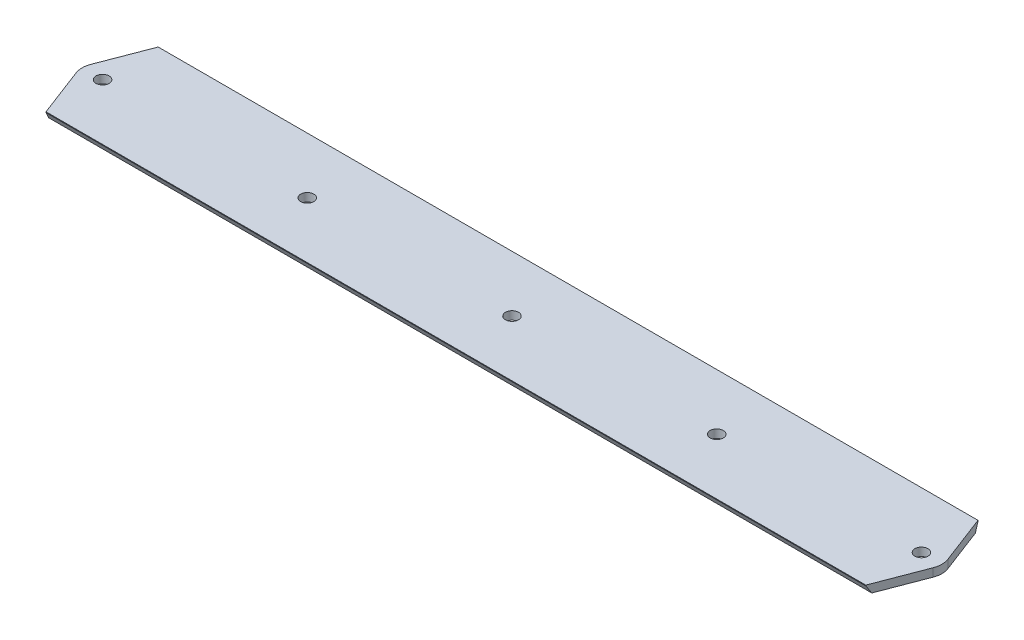
ISO-10303-21;
HEADER;
FILE_DESCRIPTION(('STEP AP214'),'2;1');
FILE_NAME('part.step','',(''),(''),'','','');
FILE_SCHEMA(('AUTOMOTIVE_DESIGN { 1 0 10303 214 1 1 1 1 }'));
ENDSEC;
DATA;
#1=APPLICATION_CONTEXT('core data for automotive mechanical design processes');
#2=APPLICATION_PROTOCOL_DEFINITION('international standard','automotive_design',2000,#1);
#3=PRODUCT_CONTEXT('',#1,'mechanical');
#4=PRODUCT('Part','Part','',(#3));
#5=PRODUCT_RELATED_PRODUCT_CATEGORY('part','',(#4));
#6=PRODUCT_DEFINITION_FORMATION('','',#4);
#7=PRODUCT_DEFINITION_CONTEXT('part definition',#1,'design');
#8=PRODUCT_DEFINITION('design','',#6,#7);
#9=PRODUCT_DEFINITION_SHAPE('','',#8);
#10=(LENGTH_UNIT() NAMED_UNIT(*) SI_UNIT(.MILLI.,.METRE.));
#11=(NAMED_UNIT(*) PLANE_ANGLE_UNIT() SI_UNIT($,.RADIAN.));
#12=(NAMED_UNIT(*) SI_UNIT($,.STERADIAN.) SOLID_ANGLE_UNIT());
#13=UNCERTAINTY_MEASURE_WITH_UNIT(LENGTH_MEASURE(1.E-05),#10,'distance_accuracy_value','');
#14=(GEOMETRIC_REPRESENTATION_CONTEXT(3) GLOBAL_UNCERTAINTY_ASSIGNED_CONTEXT((#13)) GLOBAL_UNIT_ASSIGNED_CONTEXT((#10,
#11,#12)) REPRESENTATION_CONTEXT('',''));
#15=CARTESIAN_POINT('',(0.,0.,0.));
#16=DIRECTION('',(0.,0.,1.));
#17=DIRECTION('',(1.,0.,0.));
#18=AXIS2_PLACEMENT_3D('',#15,#16,#17);
#19=CARTESIAN_POINT('',(-113.726371317059,2.,43.4843648935652));
#20=DIRECTION('',(0.934049773615858,0.,-0.357142857142858));
#21=DIRECTION('',(-0.357142857142858,0.,-0.934049773615859));
#22=AXIS2_PLACEMENT_3D('',#19,#20,#21);
#23=PLANE('',#22);
#24=DIRECTION('',(-0.18777894154717,-0.850619951466911,-0.491105657957485));
#25=VECTOR('',#24,1.);
#26=CARTESIAN_POINT('',(-121.938785428259,16.213408074005,22.0061149776285));
#27=LINE('',#26,#25);
#28=CARTESIAN_POINT('',(-125.114707866935,1.82679491924311,13.6999999999997));
#29=VERTEX_POINT('',#28);
#30=CARTESIAN_POINT('',(-125.517982696979,0.,12.6452994616205));
#31=VERTEX_POINT('',#30);
#32=EDGE_CURVE('E128',#29,#31,#27,.T.);
#33=ORIENTED_EDGE('',*,*,#32,.F.);
#34=DIRECTION('',(0.,-1.,0.));
#35=VECTOR('',#34,1.);
#36=CARTESIAN_POINT('',(-125.114707866935,2.00000000000054,13.6999999999997));
#37=LINE('',#36,#35);
#38=CARTESIAN_POINT('',(-125.114707866935,2.,13.6999999999997));
#39=VERTEX_POINT('',#38);
#40=EDGE_CURVE('E193',#29,#39,#37,.F.);
#41=ORIENTED_EDGE('',*,*,#40,.T.);
#42=DIRECTION('',(0.357142857142858,0.,0.934049773615859));
#43=VECTOR('',#42,1.);
#44=CARTESIAN_POINT('',(-113.726371317059,2.,43.4843648935652));
#45=LINE('',#44,#43);
#46=CARTESIAN_POINT('',(-129.670248868079,2.,1.78571428571428));
#47=VERTEX_POINT('',#46);
#48=EDGE_CURVE('E257',#47,#39,#45,.T.);
#49=ORIENTED_EDGE('',*,*,#48,.F.);
#50=DIRECTION('',(0.,-1.,0.));
#51=VECTOR('',#50,1.);
#52=CARTESIAN_POINT('',(-129.670248868079,2.,1.78571428571428));
#53=LINE('',#52,#51);
#54=CARTESIAN_POINT('',(-129.670248868079,0.,1.78571428571428));
#55=VERTEX_POINT('',#54);
#56=EDGE_CURVE('E172',#47,#55,#53,.T.);
#57=ORIENTED_EDGE('',*,*,#56,.T.);
#58=DIRECTION('',(0.357142857142858,0.,0.934049773615859));
#59=VECTOR('',#58,1.);
#60=CARTESIAN_POINT('',(-113.726371317059,0.,43.4843648935652));
#61=LINE('',#60,#59);
#62=EDGE_CURVE('E151',#55,#31,#61,.T.);
#63=ORIENTED_EDGE('',*,*,#62,.T.);
#64=EDGE_LOOP('',(#33,#41,#49,#57,#63));
#65=FACE_BOUND('',#64,.T.);
#66=ADVANCED_FACE('F43',(#65),#23,.F.);
#67=CARTESIAN_POINT('',(70.1039223374671,2.,26.8049046504246));
#68=DIRECTION('',(-0.934049773615859,0.,-0.357142857142855));
#69=DIRECTION('',(-0.357142857142855,0.,0.934049773615859));
#70=AXIS2_PLACEMENT_3D('',#67,#68,#69);
#71=PLANE('',#70);
#72=DIRECTION('',(0.357142857142855,0.,-0.934049773615859));
#73=VECTOR('',#72,1.);
#74=CARTESIAN_POINT('',(70.1039223374671,2.,26.8049046504246));
#75=LINE('',#74,#73);
#76=CARTESIAN_POINT('',(75.1147078669353,2.,13.6999999999999));
#77=VERTEX_POINT('',#76);
#78=CARTESIAN_POINT('',(79.6702488680794,2.,1.78571428571398));
#79=VERTEX_POINT('',#78);
#80=EDGE_CURVE('E260',#77,#79,#75,.T.);
#81=ORIENTED_EDGE('',*,*,#80,.F.);
#82=DIRECTION('',(0.,1.,0.));
#83=VECTOR('',#82,1.);
#84=CARTESIAN_POINT('',(75.1147078669353,2.00000000000033,13.6999999999999));
#85=LINE('',#84,#83);
#86=CARTESIAN_POINT('',(75.1147078669353,1.82679491924312,13.6999999999999));
#87=VERTEX_POINT('',#86);
#88=EDGE_CURVE('E142',#77,#87,#85,.F.);
#89=ORIENTED_EDGE('',*,*,#88,.T.);
#90=DIRECTION('',(-0.187778941547168,0.850619951466911,0.491105657957485));
#91=VECTOR('',#90,1.);
#92=CARTESIAN_POINT('',(73.7018319726875,8.22698236673675,17.3951499456744));
#93=LINE('',#92,#91);
#94=CARTESIAN_POINT('',(75.5179826969786,0.,12.6452994616207));
#95=VERTEX_POINT('',#94);
#96=EDGE_CURVE('E125',#95,#87,#93,.T.);
#97=ORIENTED_EDGE('',*,*,#96,.F.);
#98=DIRECTION('',(0.357142857142855,0.,-0.934049773615859));
#99=VECTOR('',#98,1.);
#100=CARTESIAN_POINT('',(70.1039223374671,0.,26.8049046504246));
#101=LINE('',#100,#99);
#102=CARTESIAN_POINT('',(79.6702488680794,0.,1.78571428571398));
#103=VERTEX_POINT('',#102);
#104=EDGE_CURVE('E140',#95,#103,#101,.T.);
#105=ORIENTED_EDGE('',*,*,#104,.T.);
#106=DIRECTION('',(0.,-1.,0.));
#107=VECTOR('',#106,1.);
#108=CARTESIAN_POINT('',(79.6702488680794,2.,1.78571428571398));
#109=LINE('',#108,#107);
#110=EDGE_CURVE('E168',#79,#103,#109,.T.);
#111=ORIENTED_EDGE('',*,*,#110,.F.);
#112=EDGE_LOOP('',(#81,#89,#97,#105,#111));
#113=FACE_BOUND('',#112,.T.);
#114=ADVANCED_FACE('F138',(#113),#71,.F.);
#115=CARTESIAN_POINT('',(0.,2.,0.));
#116=DIRECTION('',(0.,1.,0.));
#117=DIRECTION('',(0.,0.,1.));
#118=AXIS2_PLACEMENT_3D('',#115,#116,#117);
#119=PLANE('',#118);
#120=ORIENTED_EDGE('',*,*,#48,.T.);
#121=DIRECTION('',(1.,0.,0.));
#122=VECTOR('',#121,1.);
#123=CARTESIAN_POINT('',(0.,2.,13.6999999999999));
#124=LINE('',#123,#122);
#125=EDGE_CURVE('E184',#39,#77,#124,.T.);
#126=ORIENTED_EDGE('',*,*,#125,.T.);
#127=ORIENTED_EDGE('',*,*,#80,.T.);
#128=CARTESIAN_POINT('',(75.,2.,-3.2612801348364E-13));
#129=DIRECTION('',(0.,1.,0.));
#130=DIRECTION('',(0.,0.,1.));
#131=AXIS2_PLACEMENT_3D('',#128,#129,#130);
#132=CIRCLE('',#131,5.00000000000006);
#133=CARTESIAN_POINT('',(79.6702488680794,2.,-1.7857142857146));
#134=VERTEX_POINT('',#133);
#135=EDGE_CURVE('E213',#134,#79,#132,.F.);
#136=ORIENTED_EDGE('',*,*,#135,.F.);
#137=DIRECTION('',(0.35714285714287,0.,0.934049773615854));
#138=VECTOR('',#137,1.);
#139=CARTESIAN_POINT('',(70.1039223374665,2.,-26.8049046504257));
#140=LINE('',#139,#138);
#141=CARTESIAN_POINT('',(75.1147078669354,2.,-13.6999999999998));
#142=VERTEX_POINT('',#141);
#143=EDGE_CURVE('E169',#142,#134,#140,.T.);
#144=ORIENTED_EDGE('',*,*,#143,.F.);
#145=DIRECTION('',(-1.,0.,0.));
#146=VECTOR('',#145,1.);
#147=CARTESIAN_POINT('',(-125.07647191129,2.,-13.7));
#148=LINE('',#147,#146);
#149=CARTESIAN_POINT('',(-125.114707866935,2.,-13.7));
#150=VERTEX_POINT('',#149);
#151=EDGE_CURVE('E181',#142,#150,#148,.T.);
#152=ORIENTED_EDGE('',*,*,#151,.T.);
#153=DIRECTION('',(0.357142857142858,0.,-0.934049773615858));
#154=VECTOR('',#153,1.);
#155=CARTESIAN_POINT('',(-113.726371317059,2.,-43.4843648935652));
#156=LINE('',#155,#154);
#157=CARTESIAN_POINT('',(-129.670248868079,2.,-1.7857142857143));
#158=VERTEX_POINT('',#157);
#159=EDGE_CURVE('E250',#158,#150,#156,.T.);
#160=ORIENTED_EDGE('',*,*,#159,.F.);
#161=CARTESIAN_POINT('',(-125.,2.,0.));
#162=DIRECTION('',(0.,1.,0.));
#163=DIRECTION('',(0.,0.,1.));
#164=AXIS2_PLACEMENT_3D('',#161,#162,#163);
#165=CIRCLE('',#164,5.00000000000001);
#166=EDGE_CURVE('E253',#158,#47,#165,.T.);
#167=ORIENTED_EDGE('',*,*,#166,.T.);
#168=EDGE_LOOP('',(#120,#126,#127,#136,#144,#152,#160,#167));
#169=FACE_BOUND('',#168,.T.);
#170=CARTESIAN_POINT('',(-125.,2.,0.));
#171=DIRECTION('',(0.,1.,0.));
#172=DIRECTION('',(0.,0.,1.));
#173=AXIS2_PLACEMENT_3D('',#170,#171,#172);
#174=CIRCLE('',#173,1.60000000000001);
#175=CARTESIAN_POINT('',(-125.,2.,1.6));
#176=VERTEX_POINT('',#175);
#177=EDGE_CURVE('E163',#176,#176,#174,.T.);
#178=ORIENTED_EDGE('',*,*,#177,.F.);
#179=EDGE_LOOP('',(#178));
#180=FACE_BOUND('',#179,.T.);
#181=CARTESIAN_POINT('',(75.,2.,-3.2612801348364E-13));
#182=DIRECTION('',(0.,1.,0.));
#183=DIRECTION('',(0.,0.,1.));
#184=AXIS2_PLACEMENT_3D('',#181,#182,#183);
#185=CIRCLE('',#184,1.60000000000001);
#186=CARTESIAN_POINT('',(75.,2.,1.59999999999968));
#187=VERTEX_POINT('',#186);
#188=EDGE_CURVE('E234',#187,#187,#185,.F.);
#189=ORIENTED_EDGE('',*,*,#188,.T.);
#190=EDGE_LOOP('',(#189));
#191=FACE_BOUND('',#190,.T.);
#192=CARTESIAN_POINT('',(-75.,2.,0.));
#193=DIRECTION('',(0.,1.,0.));
#194=DIRECTION('',(0.,0.,1.));
#195=AXIS2_PLACEMENT_3D('',#192,#193,#194);
#196=CIRCLE('',#195,1.60000000000001);
#197=CARTESIAN_POINT('',(-75.,2.,1.6));
#198=VERTEX_POINT('',#197);
#199=EDGE_CURVE('E238',#198,#198,#196,.T.);
#200=ORIENTED_EDGE('',*,*,#199,.F.);
#201=EDGE_LOOP('',(#200));
#202=FACE_BOUND('',#201,.T.);
#203=CARTESIAN_POINT('',(-25.,2.,-1.11022302462516E-13));
#204=DIRECTION('',(0.,1.,0.));
#205=DIRECTION('',(0.,0.,1.));
#206=AXIS2_PLACEMENT_3D('',#203,#204,#205);
#207=CIRCLE('',#206,1.6);
#208=CARTESIAN_POINT('',(-25.,2.,1.59999999999989));
#209=VERTEX_POINT('',#208);
#210=EDGE_CURVE('E242',#209,#209,#207,.T.);
#211=ORIENTED_EDGE('',*,*,#210,.F.);
#212=EDGE_LOOP('',(#211));
#213=FACE_BOUND('',#212,.T.);
#214=CARTESIAN_POINT('',(25.,2.,-2.1163626406917E-13));
#215=DIRECTION('',(0.,1.,0.));
#216=DIRECTION('',(0.,0.,1.));
#217=AXIS2_PLACEMENT_3D('',#214,#215,#216);
#218=CIRCLE('',#217,1.6);
#219=CARTESIAN_POINT('',(25.,2.,1.59999999999979));
#220=VERTEX_POINT('',#219);
#221=EDGE_CURVE('E246',#220,#220,#218,.T.);
#222=ORIENTED_EDGE('',*,*,#221,.F.);
#223=EDGE_LOOP('',(#222));
#224=FACE_BOUND('',#223,.T.);
#225=ADVANCED_FACE('F209',(#169,#180,#191,#202,#213,#224),#119,.T.);
#226=CARTESIAN_POINT('',(0.,0.,0.));
#227=DIRECTION('',(0.,1.,0.));
#228=DIRECTION('',(0.,0.,1.));
#229=AXIS2_PLACEMENT_3D('',#226,#227,#228);
#230=PLANE('',#229);
#231=CARTESIAN_POINT('',(25.,0.,-2.1163626406917E-13));
#232=DIRECTION('',(0.,1.,0.));
#233=DIRECTION('',(0.,0.,1.));
#234=AXIS2_PLACEMENT_3D('',#231,#232,#233);
#235=CIRCLE('',#234,1.6);
#236=CARTESIAN_POINT('',(25.,0.,1.59999999999979));
#237=VERTEX_POINT('',#236);
#238=EDGE_CURVE('E276',#237,#237,#235,.T.);
#239=ORIENTED_EDGE('',*,*,#238,.T.);
#240=EDGE_LOOP('',(#239));
#241=FACE_BOUND('',#240,.T.);
#242=CARTESIAN_POINT('',(-25.,0.,-1.11022302462516E-13));
#243=DIRECTION('',(0.,1.,0.));
#244=DIRECTION('',(0.,0.,1.));
#245=AXIS2_PLACEMENT_3D('',#242,#243,#244);
#246=CIRCLE('',#245,1.6);
#247=CARTESIAN_POINT('',(-25.,0.,1.59999999999989));
#248=VERTEX_POINT('',#247);
#249=EDGE_CURVE('E272',#248,#248,#246,.T.);
#250=ORIENTED_EDGE('',*,*,#249,.T.);
#251=EDGE_LOOP('',(#250));
#252=FACE_BOUND('',#251,.T.);
#253=CARTESIAN_POINT('',(-75.,0.,0.));
#254=DIRECTION('',(0.,1.,0.));
#255=DIRECTION('',(0.,0.,1.));
#256=AXIS2_PLACEMENT_3D('',#253,#254,#255);
#257=CIRCLE('',#256,1.60000000000001);
#258=CARTESIAN_POINT('',(-75.,0.,1.6));
#259=VERTEX_POINT('',#258);
#260=EDGE_CURVE('E268',#259,#259,#257,.T.);
#261=ORIENTED_EDGE('',*,*,#260,.T.);
#262=EDGE_LOOP('',(#261));
#263=FACE_BOUND('',#262,.T.);
#264=CARTESIAN_POINT('',(75.,0.,-3.2612801348364E-13));
#265=DIRECTION('',(0.,1.,0.));
#266=DIRECTION('',(0.,0.,1.));
#267=AXIS2_PLACEMENT_3D('',#264,#265,#266);
#268=CIRCLE('',#267,1.60000000000001);
#269=CARTESIAN_POINT('',(75.,0.,1.59999999999968));
#270=VERTEX_POINT('',#269);
#271=EDGE_CURVE('E226',#270,#270,#268,.F.);
#272=ORIENTED_EDGE('',*,*,#271,.F.);
#273=EDGE_LOOP('',(#272));
#274=FACE_BOUND('',#273,.T.);
#275=CARTESIAN_POINT('',(-125.,0.,0.));
#276=DIRECTION('',(0.,1.,0.));
#277=DIRECTION('',(0.,0.,1.));
#278=AXIS2_PLACEMENT_3D('',#275,#276,#277);
#279=CIRCLE('',#278,1.60000000000001);
#280=CARTESIAN_POINT('',(-125.,0.,1.6));
#281=VERTEX_POINT('',#280);
#282=EDGE_CURVE('E221',#281,#281,#279,.T.);
#283=ORIENTED_EDGE('',*,*,#282,.T.);
#284=EDGE_LOOP('',(#283));
#285=FACE_BOUND('',#284,.T.);
#286=DIRECTION('',(0.357142857142858,0.,-0.934049773615858));
#287=VECTOR('',#286,1.);
#288=CARTESIAN_POINT('',(-113.726371317059,0.,-43.4843648935652));
#289=LINE('',#288,#287);
#290=CARTESIAN_POINT('',(-129.670248868079,0.,-1.7857142857143));
#291=VERTEX_POINT('',#290);
#292=CARTESIAN_POINT('',(-125.517982696979,0.,-12.6452994616208));
#293=VERTEX_POINT('',#292);
#294=EDGE_CURVE('E280',#291,#293,#289,.T.);
#295=ORIENTED_EDGE('',*,*,#294,.T.);
#296=DIRECTION('',(1.,0.,0.));
#297=VECTOR('',#296,1.);
#298=CARTESIAN_POINT('',(0.,0.,-12.6452994616206));
#299=LINE('',#298,#297);
#300=CARTESIAN_POINT('',(75.5179826969787,0.,-12.6452994616205));
#301=VERTEX_POINT('',#300);
#302=EDGE_CURVE('E133',#293,#301,#299,.T.);
#303=ORIENTED_EDGE('',*,*,#302,.T.);
#304=DIRECTION('',(0.35714285714287,0.,0.934049773615854));
#305=VECTOR('',#304,1.);
#306=CARTESIAN_POINT('',(70.1039223374665,0.,-26.8049046504257));
#307=LINE('',#306,#305);
#308=CARTESIAN_POINT('',(79.6702488680794,0.,-1.7857142857146));
#309=VERTEX_POINT('',#308);
#310=EDGE_CURVE('E155',#301,#309,#307,.T.);
#311=ORIENTED_EDGE('',*,*,#310,.T.);
#312=CARTESIAN_POINT('',(75.,0.,-3.2612801348364E-13));
#313=DIRECTION('',(0.,1.,0.));
#314=DIRECTION('',(0.,0.,1.));
#315=AXIS2_PLACEMENT_3D('',#312,#313,#314);
#316=CIRCLE('',#315,5.00000000000006);
#317=EDGE_CURVE('E149',#309,#103,#316,.F.);
#318=ORIENTED_EDGE('',*,*,#317,.T.);
#319=ORIENTED_EDGE('',*,*,#104,.F.);
#320=DIRECTION('',(1.,0.,0.));
#321=VECTOR('',#320,1.);
#322=CARTESIAN_POINT('',(0.,0.,12.6452994616206));
#323=LINE('',#322,#321);
#324=EDGE_CURVE('E122',#31,#95,#323,.T.);
#325=ORIENTED_EDGE('',*,*,#324,.F.);
#326=ORIENTED_EDGE('',*,*,#62,.F.);
#327=CARTESIAN_POINT('',(-125.,0.,0.));
#328=DIRECTION('',(0.,1.,0.));
#329=DIRECTION('',(0.,0.,1.));
#330=AXIS2_PLACEMENT_3D('',#327,#328,#329);
#331=CIRCLE('',#330,5.00000000000001);
#332=EDGE_CURVE('E157',#291,#55,#331,.T.);
#333=ORIENTED_EDGE('',*,*,#332,.F.);
#334=EDGE_LOOP('',(#295,#303,#311,#318,#319,#325,#326,#333));
#335=FACE_BOUND('',#334,.T.);
#336=ADVANCED_FACE('F147',(#241,#252,#263,#274,#285,#335),#230,.F.);
#337=CARTESIAN_POINT('',(-113.726371317059,2.,-43.4843648935652));
#338=DIRECTION('',(-0.934049773615858,0.,-0.357142857142858));
#339=DIRECTION('',(-0.357142857142858,0.,0.934049773615858));
#340=AXIS2_PLACEMENT_3D('',#337,#338,#339);
#341=PLANE('',#340);
#342=ORIENTED_EDGE('',*,*,#159,.T.);
#343=DIRECTION('',(0.,-1.,0.));
#344=VECTOR('',#343,1.);
#345=CARTESIAN_POINT('',(-125.114707866935,2.0000000000003,-13.7));
#346=LINE('',#345,#344);
#347=CARTESIAN_POINT('',(-125.114707866935,1.82679491924312,-13.7));
#348=VERTEX_POINT('',#347);
#349=EDGE_CURVE('E11',#150,#348,#346,.T.);
#350=ORIENTED_EDGE('',*,*,#349,.T.);
#351=DIRECTION('',(0.18777894154717,0.850619951466911,-0.491105657957485));
#352=VECTOR('',#351,1.);
#353=CARTESIAN_POINT('',(-121.938785428259,16.2134080740049,-22.0061149776287));
#354=LINE('',#353,#352);
#355=EDGE_CURVE('E218',#293,#348,#354,.T.);
#356=ORIENTED_EDGE('',*,*,#355,.F.);
#357=ORIENTED_EDGE('',*,*,#294,.F.);
#358=DIRECTION('',(0.,-1.,0.));
#359=VECTOR('',#358,1.);
#360=CARTESIAN_POINT('',(-129.670248868079,2.,-1.7857142857143));
#361=LINE('',#360,#359);
#362=EDGE_CURVE('E134',#158,#291,#361,.T.);
#363=ORIENTED_EDGE('',*,*,#362,.F.);
#364=EDGE_LOOP('',(#342,#350,#356,#357,#363));
#365=FACE_BOUND('',#364,.T.);
#366=ADVANCED_FACE('F289',(#365),#341,.T.);
#367=CARTESIAN_POINT('',(-125.,2.,0.));
#368=DIRECTION('',(0.,-1.,0.));
#369=DIRECTION('',(0.,0.,-1.));
#370=AXIS2_PLACEMENT_3D('',#367,#368,#369);
#371=CYLINDRICAL_SURFACE('',#370,5.00000000000001);
#372=ORIENTED_EDGE('',*,*,#332,.T.);
#373=ORIENTED_EDGE('',*,*,#56,.F.);
#374=ORIENTED_EDGE('',*,*,#166,.F.);
#375=ORIENTED_EDGE('',*,*,#362,.T.);
#376=EDGE_LOOP('',(#372,#373,#374,#375));
#377=FACE_BOUND('',#376,.T.);
#378=ADVANCED_FACE('F287',(#377),#371,.T.);
#379=CARTESIAN_POINT('',(75.,2.,-3.2612801348364E-13));
#380=DIRECTION('',(0.,-1.,0.));
#381=DIRECTION('',(0.,0.,-1.));
#382=AXIS2_PLACEMENT_3D('',#379,#380,#381);
#383=CYLINDRICAL_SURFACE('',#382,5.00000000000006);
#384=ORIENTED_EDGE('',*,*,#317,.F.);
#385=DIRECTION('',(0.,-1.,0.));
#386=VECTOR('',#385,1.);
#387=CARTESIAN_POINT('',(79.6702488680794,2.,-1.7857142857146));
#388=LINE('',#387,#386);
#389=EDGE_CURVE('E164',#134,#309,#388,.T.);
#390=ORIENTED_EDGE('',*,*,#389,.F.);
#391=ORIENTED_EDGE('',*,*,#135,.T.);
#392=ORIENTED_EDGE('',*,*,#110,.T.);
#393=EDGE_LOOP('',(#384,#390,#391,#392));
#394=FACE_BOUND('',#393,.T.);
#395=ADVANCED_FACE('F306',(#394),#383,.T.);
#396=CARTESIAN_POINT('',(70.1039223374665,2.,-26.8049046504257));
#397=DIRECTION('',(0.934049773615854,0.,-0.35714285714287));
#398=DIRECTION('',(-0.35714285714287,0.,-0.934049773615854));
#399=AXIS2_PLACEMENT_3D('',#396,#397,#398);
#400=PLANE('',#399);
#401=DIRECTION('',(0.187778941547177,-0.85061995146691,0.491105657957485));
#402=VECTOR('',#401,1.);
#403=CARTESIAN_POINT('',(73.7018319726874,8.22698236673739,-17.3951499456746));
#404=LINE('',#403,#402);
#405=CARTESIAN_POINT('',(75.1147078669354,1.82679491924312,-13.6999999999998));
#406=VERTEX_POINT('',#405);
#407=EDGE_CURVE('E205',#406,#301,#404,.T.);
#408=ORIENTED_EDGE('',*,*,#407,.F.);
#409=DIRECTION('',(0.,1.,0.));
#410=VECTOR('',#409,1.);
#411=CARTESIAN_POINT('',(75.1147078669354,2.00000000000013,-13.6999999999998));
#412=LINE('',#411,#410);
#413=EDGE_CURVE('E53',#406,#142,#412,.T.);
#414=ORIENTED_EDGE('',*,*,#413,.T.);
#415=ORIENTED_EDGE('',*,*,#143,.T.);
#416=ORIENTED_EDGE('',*,*,#389,.T.);
#417=ORIENTED_EDGE('',*,*,#310,.F.);
#418=EDGE_LOOP('',(#408,#414,#415,#416,#417));
#419=FACE_BOUND('',#418,.T.);
#420=ADVANCED_FACE('F202',(#419),#400,.T.);
#421=CARTESIAN_POINT('',(25.,2.,-2.1163626406917E-13));
#422=DIRECTION('',(0.,-1.,0.));
#423=DIRECTION('',(0.,0.,-1.));
#424=AXIS2_PLACEMENT_3D('',#421,#422,#423);
#425=CYLINDRICAL_SURFACE('',#424,1.6);
#426=ORIENTED_EDGE('',*,*,#221,.T.);
#427=EDGE_LOOP('',(#426));
#428=FACE_BOUND('',#427,.T.);
#429=ORIENTED_EDGE('',*,*,#238,.F.);
#430=EDGE_LOOP('',(#429));
#431=FACE_BOUND('',#430,.T.);
#432=ADVANCED_FACE('F309',(#428,#431),#425,.F.);
#433=CARTESIAN_POINT('',(-25.,2.,-1.11022302462516E-13));
#434=DIRECTION('',(0.,-1.,0.));
#435=DIRECTION('',(0.,0.,-1.));
#436=AXIS2_PLACEMENT_3D('',#433,#434,#435);
#437=CYLINDRICAL_SURFACE('',#436,1.6);
#438=ORIENTED_EDGE('',*,*,#210,.T.);
#439=EDGE_LOOP('',(#438));
#440=FACE_BOUND('',#439,.T.);
#441=ORIENTED_EDGE('',*,*,#249,.F.);
#442=EDGE_LOOP('',(#441));
#443=FACE_BOUND('',#442,.T.);
#444=ADVANCED_FACE('F312',(#440,#443),#437,.F.);
#445=CARTESIAN_POINT('',(-75.,2.,0.));
#446=DIRECTION('',(0.,-1.,0.));
#447=DIRECTION('',(0.,0.,-1.));
#448=AXIS2_PLACEMENT_3D('',#445,#446,#447);
#449=CYLINDRICAL_SURFACE('',#448,1.60000000000001);
#450=ORIENTED_EDGE('',*,*,#199,.T.);
#451=EDGE_LOOP('',(#450));
#452=FACE_BOUND('',#451,.T.);
#453=ORIENTED_EDGE('',*,*,#260,.F.);
#454=EDGE_LOOP('',(#453));
#455=FACE_BOUND('',#454,.T.);
#456=ADVANCED_FACE('F316',(#452,#455),#449,.F.);
#457=CARTESIAN_POINT('',(75.,2.,-3.2612801348364E-13));
#458=DIRECTION('',(0.,-1.,0.));
#459=DIRECTION('',(0.,0.,-1.));
#460=AXIS2_PLACEMENT_3D('',#457,#458,#459);
#461=CYLINDRICAL_SURFACE('',#460,1.60000000000001);
#462=ORIENTED_EDGE('',*,*,#188,.F.);
#463=EDGE_LOOP('',(#462));
#464=FACE_BOUND('',#463,.T.);
#465=ORIENTED_EDGE('',*,*,#271,.T.);
#466=EDGE_LOOP('',(#465));
#467=FACE_BOUND('',#466,.T.);
#468=ADVANCED_FACE('F320',(#464,#467),#461,.F.);
#469=CARTESIAN_POINT('',(-125.,2.,0.));
#470=DIRECTION('',(0.,-1.,0.));
#471=DIRECTION('',(0.,0.,-1.));
#472=AXIS2_PLACEMENT_3D('',#469,#470,#471);
#473=CYLINDRICAL_SURFACE('',#472,1.60000000000001);
#474=ORIENTED_EDGE('',*,*,#177,.T.);
#475=EDGE_LOOP('',(#474));
#476=FACE_BOUND('',#475,.T.);
#477=ORIENTED_EDGE('',*,*,#282,.F.);
#478=EDGE_LOOP('',(#477));
#479=FACE_BOUND('',#478,.T.);
#480=ADVANCED_FACE('F324',(#476,#479),#473,.F.);
#481=CARTESIAN_POINT('',(-130.,2.,13.7999999999997));
#482=DIRECTION('',(0.,-0.499999999999998,0.86602540378444));
#483=DIRECTION('',(0.,-0.86602540378444,-0.499999999999998));
#484=AXIS2_PLACEMENT_3D('',#481,#482,#483);
#485=PLANE('',#484);
#486=ORIENTED_EDGE('',*,*,#96,.T.);
#487=DIRECTION('',(-1.,0.,0.));
#488=VECTOR('',#487,1.);
#489=CARTESIAN_POINT('',(-130.,1.82679491924312,13.6999999999997));
#490=LINE('',#489,#488);
#491=EDGE_CURVE('E190',#87,#29,#490,.T.);
#492=ORIENTED_EDGE('',*,*,#491,.T.);
#493=ORIENTED_EDGE('',*,*,#32,.T.);
#494=ORIENTED_EDGE('',*,*,#324,.T.);
#495=EDGE_LOOP('',(#486,#492,#493,#494));
#496=FACE_BOUND('',#495,.T.);
#497=ADVANCED_FACE('F124',(#496),#485,.T.);
#498=CARTESIAN_POINT('',(-130.,-5.47557528611253,-9.48397459621564));
#499=DIRECTION('',(0.,0.499999999999998,0.86602540378444));
#500=DIRECTION('',(0.,-0.86602540378444,0.499999999999998));
#501=AXIS2_PLACEMENT_3D('',#498,#499,#500);
#502=PLANE('',#501);
#503=ORIENTED_EDGE('',*,*,#355,.T.);
#504=DIRECTION('',(1.,0.,0.));
#505=VECTOR('',#504,1.);
#506=CARTESIAN_POINT('',(75.0764719112903,1.82679491924312,-13.6999999999998));
#507=LINE('',#506,#505);
#508=EDGE_CURVE('E196',#348,#406,#507,.T.);
#509=ORIENTED_EDGE('',*,*,#508,.T.);
#510=ORIENTED_EDGE('',*,*,#407,.T.);
#511=ORIENTED_EDGE('',*,*,#302,.F.);
#512=EDGE_LOOP('',(#503,#509,#510,#511));
#513=FACE_BOUND('',#512,.T.);
#514=ADVANCED_FACE('F217',(#513),#502,.F.);
#515=CARTESIAN_POINT('',(0.,2.,13.6999999999999));
#516=DIRECTION('',(0.,0.,-1.));
#517=DIRECTION('',(1.,0.,0.));
#518=AXIS2_PLACEMENT_3D('',#515,#516,#517);
#519=PLANE('',#518);
#520=ORIENTED_EDGE('',*,*,#40,.F.);
#521=ORIENTED_EDGE('',*,*,#491,.F.);
#522=ORIENTED_EDGE('',*,*,#88,.F.);
#523=ORIENTED_EDGE('',*,*,#125,.F.);
#524=EDGE_LOOP('',(#520,#521,#522,#523));
#525=FACE_BOUND('',#524,.T.);
#526=ADVANCED_FACE('F294',(#525),#519,.F.);
#527=CARTESIAN_POINT('',(-130.,1.82679491924312,-13.7));
#528=DIRECTION('',(0.,0.,-1.));
#529=DIRECTION('',(-1.,0.,0.));
#530=AXIS2_PLACEMENT_3D('',#527,#528,#529);
#531=PLANE('',#530);
#532=ORIENTED_EDGE('',*,*,#349,.F.);
#533=ORIENTED_EDGE('',*,*,#151,.F.);
#534=ORIENTED_EDGE('',*,*,#413,.F.);
#535=ORIENTED_EDGE('',*,*,#508,.F.);
#536=EDGE_LOOP('',(#532,#533,#534,#535));
#537=FACE_BOUND('',#536,.T.);
#538=ADVANCED_FACE('F46',(#537),#531,.T.);
#539=CLOSED_SHELL('',(#66,#114,#225,#336,#366,#378,#395,#420,#432,#444,#456,#468,#480,#497,#514,
#526,#538));
#540=MANIFOLD_SOLID_BREP('B2',#539);
#541=ADVANCED_BREP_SHAPE_REPRESENTATION('',(#18,#540),#14);
#542=SHAPE_DEFINITION_REPRESENTATION(#9,#541);
ENDSEC;
END-ISO-10303-21;
